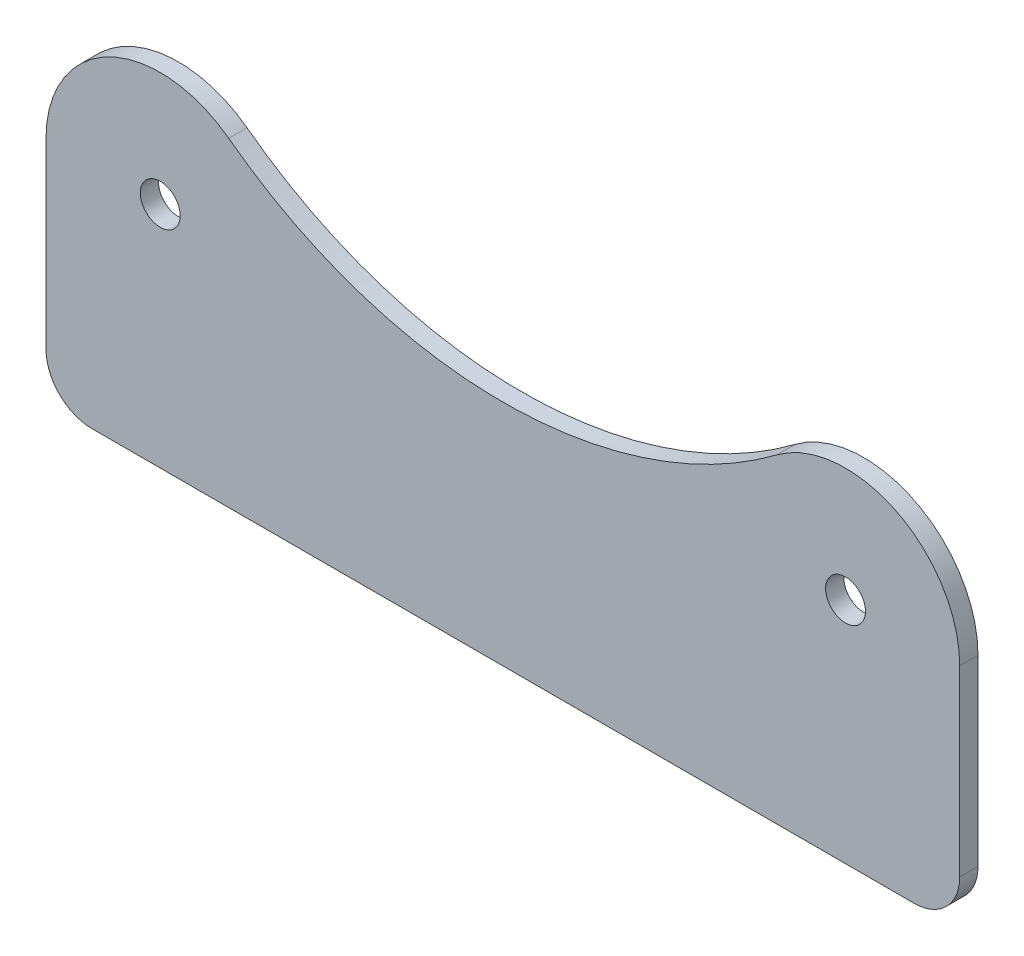
ISO-10303-21;
HEADER;
FILE_DESCRIPTION(('STEP AP214'),'2;1');
FILE_NAME('part.step','',(''),(''),'','','');
FILE_SCHEMA(('AUTOMOTIVE_DESIGN { 1 0 10303 214 1 1 1 1 }'));
ENDSEC;
DATA;
#1=APPLICATION_CONTEXT('core data for automotive mechanical design processes');
#2=APPLICATION_PROTOCOL_DEFINITION('international standard','automotive_design',2000,#1);
#3=PRODUCT_CONTEXT('',#1,'mechanical');
#4=PRODUCT('Part','Part','',(#3));
#5=PRODUCT_RELATED_PRODUCT_CATEGORY('part','',(#4));
#6=PRODUCT_DEFINITION_FORMATION('','',#4);
#7=PRODUCT_DEFINITION_CONTEXT('part definition',#1,'design');
#8=PRODUCT_DEFINITION('design','',#6,#7);
#9=PRODUCT_DEFINITION_SHAPE('','',#8);
#10=(LENGTH_UNIT() NAMED_UNIT(*) SI_UNIT(.MILLI.,.METRE.));
#11=(NAMED_UNIT(*) PLANE_ANGLE_UNIT() SI_UNIT($,.RADIAN.));
#12=(NAMED_UNIT(*) SI_UNIT($,.STERADIAN.) SOLID_ANGLE_UNIT());
#13=UNCERTAINTY_MEASURE_WITH_UNIT(LENGTH_MEASURE(1.E-05),#10,'distance_accuracy_value','');
#14=(GEOMETRIC_REPRESENTATION_CONTEXT(3) GLOBAL_UNCERTAINTY_ASSIGNED_CONTEXT((#13)) GLOBAL_UNIT_ASSIGNED_CONTEXT((#10,
#11,#12)) REPRESENTATION_CONTEXT('',''));
#15=CARTESIAN_POINT('',(0.,0.,0.));
#16=DIRECTION('',(0.,0.,1.));
#17=DIRECTION('',(1.,0.,0.));
#18=AXIS2_PLACEMENT_3D('',#15,#16,#17);
#19=CARTESIAN_POINT('',(25.,50.,4.));
#20=DIRECTION('',(0.,0.,-1.));
#21=DIRECTION('',(-1.,0.,0.));
#22=AXIS2_PLACEMENT_3D('',#19,#20,#21);
#23=PLANE('',#22);
#24=CARTESIAN_POINT('',(25.,50.,4.));
#25=DIRECTION('',(0.,0.,1.));
#26=DIRECTION('',(-1.,0.,0.));
#27=AXIS2_PLACEMENT_3D('',#24,#25,#26);
#28=CIRCLE('',#27,25.);
#29=CARTESIAN_POINT('',(40.,70.,4.));
#30=VERTEX_POINT('',#29);
#31=CARTESIAN_POINT('',(0.,50.,4.));
#32=VERTEX_POINT('',#31);
#33=EDGE_CURVE('E145',#30,#32,#28,.T.);
#34=ORIENTED_EDGE('',*,*,#33,.T.);
#35=DIRECTION('',(0.,-1.,0.));
#36=VECTOR('',#35,1.);
#37=CARTESIAN_POINT('',(0.,50.,4.));
#38=LINE('',#37,#36);
#39=CARTESIAN_POINT('',(0.,10.,4.));
#40=VERTEX_POINT('',#39);
#41=EDGE_CURVE('E93',#32,#40,#38,.T.);
#42=ORIENTED_EDGE('',*,*,#41,.T.);
#43=CARTESIAN_POINT('',(10.,10.,4.));
#44=DIRECTION('',(0.,0.,1.));
#45=DIRECTION('',(1.,0.,0.));
#46=AXIS2_PLACEMENT_3D('',#43,#44,#45);
#47=CIRCLE('',#46,10.);
#48=CARTESIAN_POINT('',(10.,0.,4.));
#49=VERTEX_POINT('',#48);
#50=EDGE_CURVE('E160',#40,#49,#47,.T.);
#51=ORIENTED_EDGE('',*,*,#50,.T.);
#52=DIRECTION('',(1.,0.,0.));
#53=VECTOR('',#52,1.);
#54=CARTESIAN_POINT('',(10.,0.,4.));
#55=LINE('',#54,#53);
#56=CARTESIAN_POINT('',(190.,0.,4.));
#57=VERTEX_POINT('',#56);
#58=EDGE_CURVE('E173',#49,#57,#55,.T.);
#59=ORIENTED_EDGE('',*,*,#58,.T.);
#60=CARTESIAN_POINT('',(190.,10.,4.));
#61=DIRECTION('',(0.,0.,1.));
#62=DIRECTION('',(-1.,0.,0.));
#63=AXIS2_PLACEMENT_3D('',#60,#61,#62);
#64=CIRCLE('',#63,9.99999999999999);
#65=CARTESIAN_POINT('',(200.,10.,4.));
#66=VERTEX_POINT('',#65);
#67=EDGE_CURVE('E112',#57,#66,#64,.T.);
#68=ORIENTED_EDGE('',*,*,#67,.T.);
#69=DIRECTION('',(0.,1.,0.));
#70=VECTOR('',#69,1.);
#71=CARTESIAN_POINT('',(200.,10.,4.));
#72=LINE('',#71,#70);
#73=CARTESIAN_POINT('',(200.,50.,4.));
#74=VERTEX_POINT('',#73);
#75=EDGE_CURVE('E106',#66,#74,#72,.T.);
#76=ORIENTED_EDGE('',*,*,#75,.T.);
#77=CARTESIAN_POINT('',(175.,50.,4.));
#78=DIRECTION('',(0.,0.,1.));
#79=DIRECTION('',(-1.,0.,0.));
#80=AXIS2_PLACEMENT_3D('',#77,#78,#79);
#81=CIRCLE('',#80,25.);
#82=CARTESIAN_POINT('',(160.,70.,4.));
#83=VERTEX_POINT('',#82);
#84=EDGE_CURVE('E110',#74,#83,#81,.T.);
#85=ORIENTED_EDGE('',*,*,#84,.T.);
#86=CARTESIAN_POINT('',(99.9999999999999,150.,4.));
#87=DIRECTION('',(0.,0.,-1.));
#88=DIRECTION('',(-1.,0.,0.));
#89=AXIS2_PLACEMENT_3D('',#86,#87,#88);
#90=CIRCLE('',#89,100.);
#91=EDGE_CURVE('E50',#83,#30,#90,.T.);
#92=ORIENTED_EDGE('',*,*,#91,.T.);
#93=EDGE_LOOP('',(#34,#42,#51,#59,#68,#76,#85,#92));
#94=FACE_BOUND('',#93,.T.);
#95=CARTESIAN_POINT('',(25.,50.,4.));
#96=DIRECTION('',(0.,0.,1.));
#97=DIRECTION('',(1.,0.,0.));
#98=AXIS2_PLACEMENT_3D('',#95,#96,#97);
#99=CIRCLE('',#98,4.36562500000001);
#100=CARTESIAN_POINT('',(29.365625,50.,4.));
#101=VERTEX_POINT('',#100);
#102=EDGE_CURVE('E134',#101,#101,#99,.T.);
#103=ORIENTED_EDGE('',*,*,#102,.F.);
#104=EDGE_LOOP('',(#103));
#105=FACE_BOUND('',#104,.T.);
#106=CARTESIAN_POINT('',(175.,50.,4.));
#107=DIRECTION('',(0.,0.,1.));
#108=DIRECTION('',(1.,0.,0.));
#109=AXIS2_PLACEMENT_3D('',#106,#107,#108);
#110=CIRCLE('',#109,4.365625);
#111=CARTESIAN_POINT('',(179.365625,50.,4.));
#112=VERTEX_POINT('',#111);
#113=EDGE_CURVE('E182',#112,#112,#110,.T.);
#114=ORIENTED_EDGE('',*,*,#113,.F.);
#115=EDGE_LOOP('',(#114));
#116=FACE_BOUND('',#115,.T.);
#117=ADVANCED_FACE('F33',(#94,#105,#116),#23,.F.);
#118=CARTESIAN_POINT('',(25.,50.,0.));
#119=DIRECTION('',(0.,0.,-1.));
#120=DIRECTION('',(-1.,0.,0.));
#121=AXIS2_PLACEMENT_3D('',#118,#119,#120);
#122=PLANE('',#121);
#123=CARTESIAN_POINT('',(25.,50.,0.));
#124=DIRECTION('',(0.,0.,1.));
#125=DIRECTION('',(1.,0.,0.));
#126=AXIS2_PLACEMENT_3D('',#123,#124,#125);
#127=CIRCLE('',#126,4.36562500000001);
#128=CARTESIAN_POINT('',(29.365625,50.,0.));
#129=VERTEX_POINT('',#128);
#130=EDGE_CURVE('E179',#129,#129,#127,.T.);
#131=ORIENTED_EDGE('',*,*,#130,.T.);
#132=EDGE_LOOP('',(#131));
#133=FACE_BOUND('',#132,.T.);
#134=CARTESIAN_POINT('',(25.,50.,0.));
#135=DIRECTION('',(0.,0.,1.));
#136=DIRECTION('',(-1.,0.,0.));
#137=AXIS2_PLACEMENT_3D('',#134,#135,#136);
#138=CIRCLE('',#137,25.);
#139=CARTESIAN_POINT('',(40.,70.,0.));
#140=VERTEX_POINT('',#139);
#141=CARTESIAN_POINT('',(0.,50.,0.));
#142=VERTEX_POINT('',#141);
#143=EDGE_CURVE('E130',#140,#142,#138,.T.);
#144=ORIENTED_EDGE('',*,*,#143,.F.);
#145=CARTESIAN_POINT('',(99.9999999999999,150.,0.));
#146=DIRECTION('',(0.,0.,-1.));
#147=DIRECTION('',(-1.,0.,0.));
#148=AXIS2_PLACEMENT_3D('',#145,#146,#147);
#149=CIRCLE('',#148,100.);
#150=CARTESIAN_POINT('',(160.,70.,0.));
#151=VERTEX_POINT('',#150);
#152=EDGE_CURVE('E85',#151,#140,#149,.T.);
#153=ORIENTED_EDGE('',*,*,#152,.F.);
#154=CARTESIAN_POINT('',(175.,50.,0.));
#155=DIRECTION('',(0.,0.,1.));
#156=DIRECTION('',(-1.,0.,0.));
#157=AXIS2_PLACEMENT_3D('',#154,#155,#156);
#158=CIRCLE('',#157,25.);
#159=CARTESIAN_POINT('',(200.,50.,0.));
#160=VERTEX_POINT('',#159);
#161=EDGE_CURVE('E79',#160,#151,#158,.T.);
#162=ORIENTED_EDGE('',*,*,#161,.F.);
#163=DIRECTION('',(0.,1.,0.));
#164=VECTOR('',#163,1.);
#165=CARTESIAN_POINT('',(200.,10.,0.));
#166=LINE('',#165,#164);
#167=CARTESIAN_POINT('',(200.,10.,0.));
#168=VERTEX_POINT('',#167);
#169=EDGE_CURVE('E120',#168,#160,#166,.T.);
#170=ORIENTED_EDGE('',*,*,#169,.F.);
#171=CARTESIAN_POINT('',(190.,10.,0.));
#172=DIRECTION('',(0.,0.,1.));
#173=DIRECTION('',(-1.,0.,0.));
#174=AXIS2_PLACEMENT_3D('',#171,#172,#173);
#175=CIRCLE('',#174,9.99999999999999);
#176=CARTESIAN_POINT('',(190.,0.,0.));
#177=VERTEX_POINT('',#176);
#178=EDGE_CURVE('E140',#177,#168,#175,.T.);
#179=ORIENTED_EDGE('',*,*,#178,.F.);
#180=DIRECTION('',(1.,0.,0.));
#181=VECTOR('',#180,1.);
#182=CARTESIAN_POINT('',(10.,0.,0.));
#183=LINE('',#182,#181);
#184=CARTESIAN_POINT('',(10.,0.,0.));
#185=VERTEX_POINT('',#184);
#186=EDGE_CURVE('E138',#185,#177,#183,.T.);
#187=ORIENTED_EDGE('',*,*,#186,.F.);
#188=CARTESIAN_POINT('',(10.,10.,0.));
#189=DIRECTION('',(0.,0.,1.));
#190=DIRECTION('',(1.,0.,0.));
#191=AXIS2_PLACEMENT_3D('',#188,#189,#190);
#192=CIRCLE('',#191,10.);
#193=CARTESIAN_POINT('',(0.,10.,0.));
#194=VERTEX_POINT('',#193);
#195=EDGE_CURVE('E136',#194,#185,#192,.T.);
#196=ORIENTED_EDGE('',*,*,#195,.F.);
#197=DIRECTION('',(0.,-1.,0.));
#198=VECTOR('',#197,1.);
#199=CARTESIAN_POINT('',(0.,50.,0.));
#200=LINE('',#199,#198);
#201=EDGE_CURVE('E133',#142,#194,#200,.T.);
#202=ORIENTED_EDGE('',*,*,#201,.F.);
#203=EDGE_LOOP('',(#144,#153,#162,#170,#179,#187,#196,#202));
#204=FACE_BOUND('',#203,.T.);
#205=CARTESIAN_POINT('',(175.,50.,0.));
#206=DIRECTION('',(0.,0.,1.));
#207=DIRECTION('',(1.,0.,0.));
#208=AXIS2_PLACEMENT_3D('',#205,#206,#207);
#209=CIRCLE('',#208,4.365625);
#210=CARTESIAN_POINT('',(179.365625,50.,0.));
#211=VERTEX_POINT('',#210);
#212=EDGE_CURVE('E185',#211,#211,#209,.T.);
#213=ORIENTED_EDGE('',*,*,#212,.T.);
#214=EDGE_LOOP('',(#213));
#215=FACE_BOUND('',#214,.T.);
#216=ADVANCED_FACE('F164',(#133,#204,#215),#122,.T.);
#217=CARTESIAN_POINT('',(25.,50.,4.));
#218=DIRECTION('',(0.,0.,-1.));
#219=DIRECTION('',(-1.,0.,0.));
#220=AXIS2_PLACEMENT_3D('',#217,#218,#219);
#221=CYLINDRICAL_SURFACE('',#220,25.);
#222=ORIENTED_EDGE('',*,*,#143,.T.);
#223=DIRECTION('',(0.,0.,-1.));
#224=VECTOR('',#223,1.);
#225=CARTESIAN_POINT('',(0.,50.,4.));
#226=LINE('',#225,#224);
#227=EDGE_CURVE('E11',#32,#142,#226,.T.);
#228=ORIENTED_EDGE('',*,*,#227,.F.);
#229=ORIENTED_EDGE('',*,*,#33,.F.);
#230=DIRECTION('',(0.,0.,-1.));
#231=VECTOR('',#230,1.);
#232=CARTESIAN_POINT('',(40.,70.,4.));
#233=LINE('',#232,#231);
#234=EDGE_CURVE('E126',#30,#140,#233,.T.);
#235=ORIENTED_EDGE('',*,*,#234,.T.);
#236=EDGE_LOOP('',(#222,#228,#229,#235));
#237=FACE_BOUND('',#236,.T.);
#238=ADVANCED_FACE('F35',(#237),#221,.T.);
#239=CARTESIAN_POINT('',(0.,50.,4.));
#240=DIRECTION('',(1.,0.,0.));
#241=DIRECTION('',(0.,1.,0.));
#242=AXIS2_PLACEMENT_3D('',#239,#240,#241);
#243=PLANE('',#242);
#244=ORIENTED_EDGE('',*,*,#201,.T.);
#245=DIRECTION('',(0.,0.,-1.));
#246=VECTOR('',#245,1.);
#247=CARTESIAN_POINT('',(0.,10.,4.));
#248=LINE('',#247,#246);
#249=EDGE_CURVE('E42',#40,#194,#248,.T.);
#250=ORIENTED_EDGE('',*,*,#249,.F.);
#251=ORIENTED_EDGE('',*,*,#41,.F.);
#252=ORIENTED_EDGE('',*,*,#227,.T.);
#253=EDGE_LOOP('',(#244,#250,#251,#252));
#254=FACE_BOUND('',#253,.T.);
#255=ADVANCED_FACE('F217',(#254),#243,.F.);
#256=CARTESIAN_POINT('',(10.,10.,4.));
#257=DIRECTION('',(0.,0.,-1.));
#258=DIRECTION('',(-1.,0.,0.));
#259=AXIS2_PLACEMENT_3D('',#256,#257,#258);
#260=CYLINDRICAL_SURFACE('',#259,10.);
#261=ORIENTED_EDGE('',*,*,#195,.T.);
#262=DIRECTION('',(0.,0.,-1.));
#263=VECTOR('',#262,1.);
#264=CARTESIAN_POINT('',(10.,0.,4.));
#265=LINE('',#264,#263);
#266=EDGE_CURVE('E152',#49,#185,#265,.T.);
#267=ORIENTED_EDGE('',*,*,#266,.F.);
#268=ORIENTED_EDGE('',*,*,#50,.F.);
#269=ORIENTED_EDGE('',*,*,#249,.T.);
#270=EDGE_LOOP('',(#261,#267,#268,#269));
#271=FACE_BOUND('',#270,.T.);
#272=ADVANCED_FACE('F158',(#271),#260,.T.);
#273=CARTESIAN_POINT('',(10.,0.,4.));
#274=DIRECTION('',(0.,1.,0.));
#275=DIRECTION('',(0.,0.,1.));
#276=AXIS2_PLACEMENT_3D('',#273,#274,#275);
#277=PLANE('',#276);
#278=ORIENTED_EDGE('',*,*,#186,.T.);
#279=DIRECTION('',(0.,0.,-1.));
#280=VECTOR('',#279,1.);
#281=CARTESIAN_POINT('',(190.,0.,4.));
#282=LINE('',#281,#280);
#283=EDGE_CURVE('E149',#57,#177,#282,.T.);
#284=ORIENTED_EDGE('',*,*,#283,.F.);
#285=ORIENTED_EDGE('',*,*,#58,.F.);
#286=ORIENTED_EDGE('',*,*,#266,.T.);
#287=EDGE_LOOP('',(#278,#284,#285,#286));
#288=FACE_BOUND('',#287,.T.);
#289=ADVANCED_FACE('F169',(#288),#277,.F.);
#290=CARTESIAN_POINT('',(190.,10.,4.));
#291=DIRECTION('',(0.,0.,-1.));
#292=DIRECTION('',(-1.,0.,0.));
#293=AXIS2_PLACEMENT_3D('',#290,#291,#292);
#294=CYLINDRICAL_SURFACE('',#293,9.99999999999999);
#295=ORIENTED_EDGE('',*,*,#178,.T.);
#296=DIRECTION('',(0.,0.,-1.));
#297=VECTOR('',#296,1.);
#298=CARTESIAN_POINT('',(200.,10.,4.));
#299=LINE('',#298,#297);
#300=EDGE_CURVE('E121',#66,#168,#299,.T.);
#301=ORIENTED_EDGE('',*,*,#300,.F.);
#302=ORIENTED_EDGE('',*,*,#67,.F.);
#303=ORIENTED_EDGE('',*,*,#283,.T.);
#304=EDGE_LOOP('',(#295,#301,#302,#303));
#305=FACE_BOUND('',#304,.T.);
#306=ADVANCED_FACE('F172',(#305),#294,.T.);
#307=CARTESIAN_POINT('',(200.,10.,4.));
#308=DIRECTION('',(-1.,0.,0.));
#309=DIRECTION('',(0.,-1.,0.));
#310=AXIS2_PLACEMENT_3D('',#307,#308,#309);
#311=PLANE('',#310);
#312=ORIENTED_EDGE('',*,*,#169,.T.);
#313=DIRECTION('',(0.,0.,-1.));
#314=VECTOR('',#313,1.);
#315=CARTESIAN_POINT('',(200.,50.,4.));
#316=LINE('',#315,#314);
#317=EDGE_CURVE('E117',#74,#160,#316,.T.);
#318=ORIENTED_EDGE('',*,*,#317,.F.);
#319=ORIENTED_EDGE('',*,*,#75,.F.);
#320=ORIENTED_EDGE('',*,*,#300,.T.);
#321=EDGE_LOOP('',(#312,#318,#319,#320));
#322=FACE_BOUND('',#321,.T.);
#323=ADVANCED_FACE('F118',(#322),#311,.F.);
#324=CARTESIAN_POINT('',(175.,50.,4.));
#325=DIRECTION('',(0.,0.,-1.));
#326=DIRECTION('',(-1.,0.,0.));
#327=AXIS2_PLACEMENT_3D('',#324,#325,#326);
#328=CYLINDRICAL_SURFACE('',#327,25.);
#329=ORIENTED_EDGE('',*,*,#161,.T.);
#330=DIRECTION('',(0.,0.,-1.));
#331=VECTOR('',#330,1.);
#332=CARTESIAN_POINT('',(160.,70.,4.));
#333=LINE('',#332,#331);
#334=EDGE_CURVE('E122',#83,#151,#333,.T.);
#335=ORIENTED_EDGE('',*,*,#334,.F.);
#336=ORIENTED_EDGE('',*,*,#84,.F.);
#337=ORIENTED_EDGE('',*,*,#317,.T.);
#338=EDGE_LOOP('',(#329,#335,#336,#337));
#339=FACE_BOUND('',#338,.T.);
#340=ADVANCED_FACE('F124',(#339),#328,.T.);
#341=CARTESIAN_POINT('',(99.9999999999999,150.,4.));
#342=DIRECTION('',(0.,0.,-1.));
#343=DIRECTION('',(-1.,0.,0.));
#344=AXIS2_PLACEMENT_3D('',#341,#342,#343);
#345=CYLINDRICAL_SURFACE('',#344,100.);
#346=ORIENTED_EDGE('',*,*,#152,.T.);
#347=ORIENTED_EDGE('',*,*,#234,.F.);
#348=ORIENTED_EDGE('',*,*,#91,.F.);
#349=ORIENTED_EDGE('',*,*,#334,.T.);
#350=EDGE_LOOP('',(#346,#347,#348,#349));
#351=FACE_BOUND('',#350,.T.);
#352=ADVANCED_FACE('F205',(#351),#345,.F.);
#353=CARTESIAN_POINT('',(25.,50.,4.));
#354=DIRECTION('',(0.,0.,-1.));
#355=DIRECTION('',(-1.,0.,0.));
#356=AXIS2_PLACEMENT_3D('',#353,#354,#355);
#357=CYLINDRICAL_SURFACE('',#356,4.36562500000001);
#358=ORIENTED_EDGE('',*,*,#102,.T.);
#359=EDGE_LOOP('',(#358));
#360=FACE_BOUND('',#359,.T.);
#361=ORIENTED_EDGE('',*,*,#130,.F.);
#362=EDGE_LOOP('',(#361));
#363=FACE_BOUND('',#362,.T.);
#364=ADVANCED_FACE('F202',(#360,#363),#357,.F.);
#365=CARTESIAN_POINT('',(175.,50.,4.));
#366=DIRECTION('',(0.,0.,-1.));
#367=DIRECTION('',(-1.,0.,0.));
#368=AXIS2_PLACEMENT_3D('',#365,#366,#367);
#369=CYLINDRICAL_SURFACE('',#368,4.365625);
#370=ORIENTED_EDGE('',*,*,#113,.T.);
#371=EDGE_LOOP('',(#370));
#372=FACE_BOUND('',#371,.T.);
#373=ORIENTED_EDGE('',*,*,#212,.F.);
#374=EDGE_LOOP('',(#373));
#375=FACE_BOUND('',#374,.T.);
#376=ADVANCED_FACE('F191',(#372,#375),#369,.F.);
#377=CLOSED_SHELL('',(#117,#216,#238,#255,#272,#289,#306,#323,#340,#352,#364,#376));
#378=MANIFOLD_SOLID_BREP('B2',#377);
#379=ADVANCED_BREP_SHAPE_REPRESENTATION('',(#18,#378),#14);
#380=SHAPE_DEFINITION_REPRESENTATION(#9,#379);
ENDSEC;
END-ISO-10303-21;
